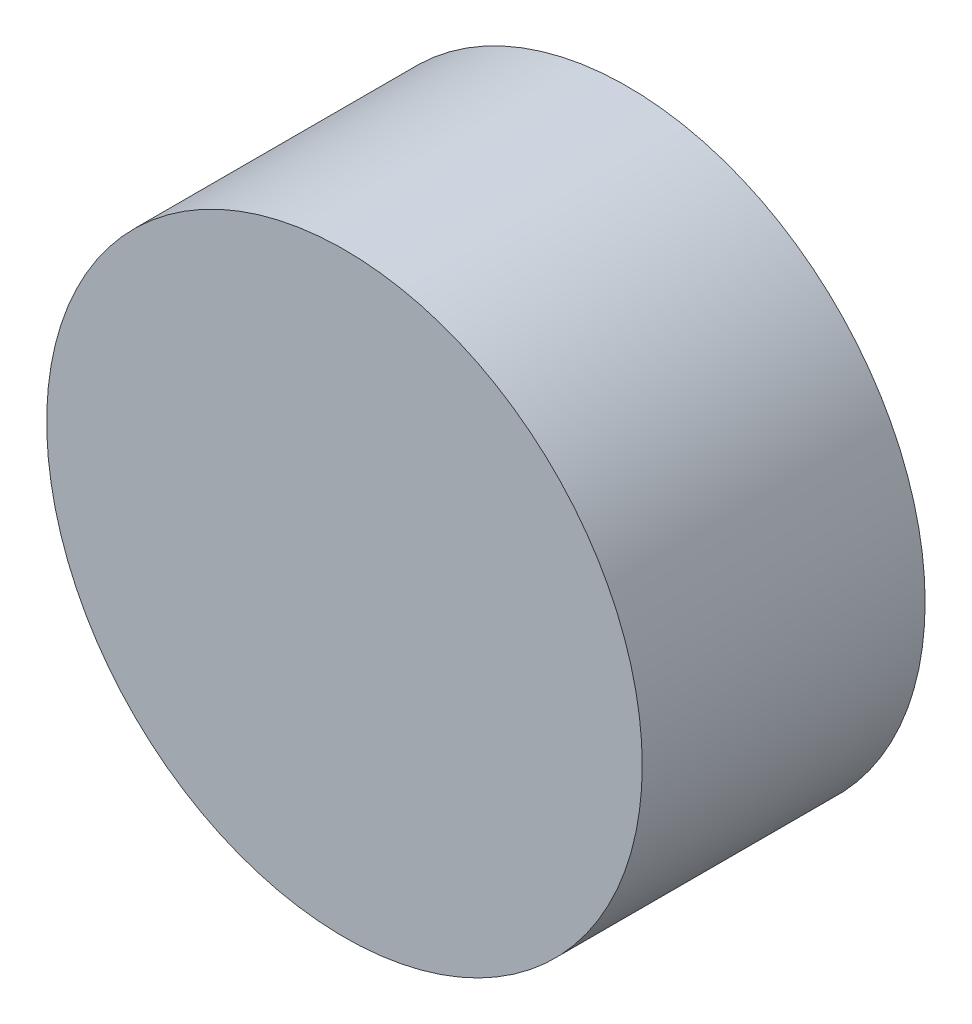
ISO-10303-21;
HEADER;
FILE_DESCRIPTION(('STEP AP214'),'2;1');
FILE_NAME('part.step','',(''),(''),'','','');
FILE_SCHEMA(('AUTOMOTIVE_DESIGN { 1 0 10303 214 1 1 1 1 }'));
ENDSEC;
DATA;
#1=APPLICATION_CONTEXT('core data for automotive mechanical design processes');
#2=APPLICATION_PROTOCOL_DEFINITION('international standard','automotive_design',2000,#1);
#3=PRODUCT_CONTEXT('',#1,'mechanical');
#4=PRODUCT('Part','Part','',(#3));
#5=PRODUCT_RELATED_PRODUCT_CATEGORY('part','',(#4));
#6=PRODUCT_DEFINITION_FORMATION('','',#4);
#7=PRODUCT_DEFINITION_CONTEXT('part definition',#1,'design');
#8=PRODUCT_DEFINITION('design','',#6,#7);
#9=PRODUCT_DEFINITION_SHAPE('','',#8);
#10=(LENGTH_UNIT() NAMED_UNIT(*) SI_UNIT(.MILLI.,.METRE.));
#11=(NAMED_UNIT(*) PLANE_ANGLE_UNIT() SI_UNIT($,.RADIAN.));
#12=(NAMED_UNIT(*) SI_UNIT($,.STERADIAN.) SOLID_ANGLE_UNIT());
#13=UNCERTAINTY_MEASURE_WITH_UNIT(LENGTH_MEASURE(1.E-05),#10,'distance_accuracy_value','');
#14=(GEOMETRIC_REPRESENTATION_CONTEXT(3) GLOBAL_UNCERTAINTY_ASSIGNED_CONTEXT((#13)) GLOBAL_UNIT_ASSIGNED_CONTEXT((#10,
#11,#12)) REPRESENTATION_CONTEXT('',''));
#15=CARTESIAN_POINT('',(0.,0.,0.));
#16=DIRECTION('',(0.,0.,1.));
#17=DIRECTION('',(1.,0.,0.));
#18=AXIS2_PLACEMENT_3D('',#15,#16,#17);
#19=CARTESIAN_POINT('',(0.,0.,38.));
#20=DIRECTION('',(0.,0.,-1.));
#21=DIRECTION('',(-1.,0.,0.));
#22=AXIS2_PLACEMENT_3D('',#19,#20,#21);
#23=CYLINDRICAL_SURFACE('',#22,40.);
#24=CARTESIAN_POINT('',(0.,0.,38.));
#25=DIRECTION('',(0.,0.,1.));
#26=DIRECTION('',(1.,0.,0.));
#27=AXIS2_PLACEMENT_3D('',#24,#25,#26);
#28=CIRCLE('',#27,40.);
#29=CARTESIAN_POINT('',(40.,0.,38.));
#30=VERTEX_POINT('',#29);
#31=EDGE_CURVE('E10',#30,#30,#28,.T.);
#32=ORIENTED_EDGE('',*,*,#31,.F.);
#33=EDGE_LOOP('',(#32));
#34=FACE_BOUND('',#33,.T.);
#35=CARTESIAN_POINT('',(0.,0.,0.));
#36=DIRECTION('',(0.,0.,1.));
#37=DIRECTION('',(1.,0.,0.));
#38=AXIS2_PLACEMENT_3D('',#35,#36,#37);
#39=CIRCLE('',#38,40.);
#40=CARTESIAN_POINT('',(40.,0.,0.));
#41=VERTEX_POINT('',#40);
#42=EDGE_CURVE('E39',#41,#41,#39,.T.);
#43=ORIENTED_EDGE('',*,*,#42,.T.);
#44=EDGE_LOOP('',(#43));
#45=FACE_BOUND('',#44,.T.);
#46=ADVANCED_FACE('F36',(#34,#45),#23,.T.);
#47=CARTESIAN_POINT('',(0.,0.,38.));
#48=DIRECTION('',(0.,0.,1.));
#49=DIRECTION('',(1.,0.,0.));
#50=AXIS2_PLACEMENT_3D('',#47,#48,#49);
#51=PLANE('',#50);
#52=ORIENTED_EDGE('',*,*,#31,.T.);
#53=EDGE_LOOP('',(#52));
#54=FACE_BOUND('',#53,.T.);
#55=ADVANCED_FACE('F55',(#54),#51,.T.);
#56=CARTESIAN_POINT('',(0.,0.,0.));
#57=DIRECTION('',(0.,0.,1.));
#58=DIRECTION('',(1.,0.,0.));
#59=AXIS2_PLACEMENT_3D('',#56,#57,#58);
#60=PLANE('',#59);
#61=ORIENTED_EDGE('',*,*,#42,.F.);
#62=EDGE_LOOP('',(#61));
#63=FACE_BOUND('',#62,.T.);
#64=ADVANCED_FACE('F53',(#63),#60,.F.);
#65=CLOSED_SHELL('',(#46,#55,#64));
#66=MANIFOLD_SOLID_BREP('B2',#65);
#67=ADVANCED_BREP_SHAPE_REPRESENTATION('',(#18,#66),#14);
#68=SHAPE_DEFINITION_REPRESENTATION(#9,#67);
ENDSEC;
END-ISO-10303-21;
